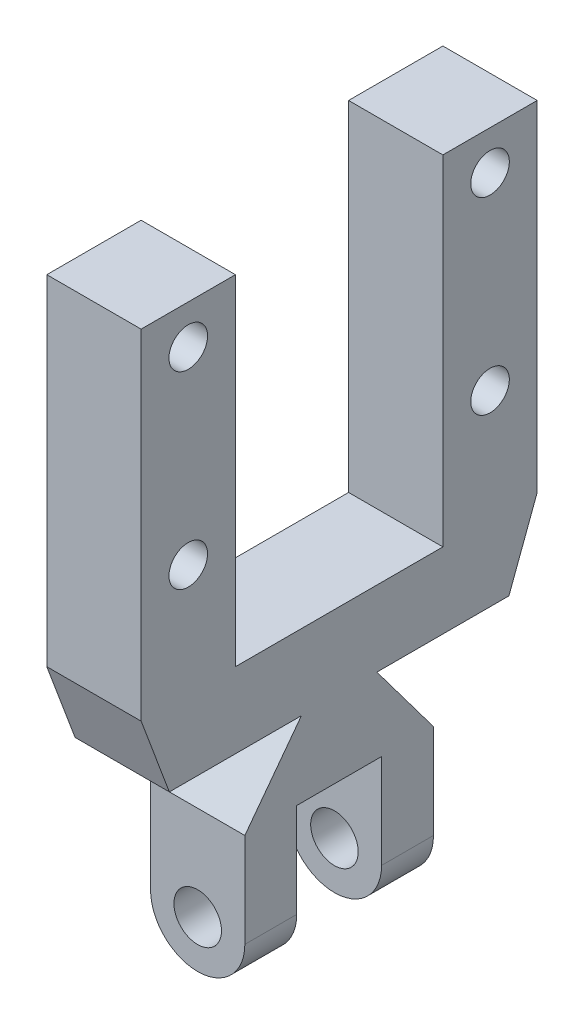
ISO-10303-21;
HEADER;
FILE_DESCRIPTION(('STEP AP214'),'2;1');
FILE_NAME('part.step','',(''),(''),'','','');
FILE_SCHEMA(('AUTOMOTIVE_DESIGN { 1 0 10303 214 1 1 1 1 }'));
ENDSEC;
DATA;
#1=APPLICATION_CONTEXT('core data for automotive mechanical design processes');
#2=APPLICATION_PROTOCOL_DEFINITION('international standard','automotive_design',2000,#1);
#3=PRODUCT_CONTEXT('',#1,'mechanical');
#4=PRODUCT('Part','Part','',(#3));
#5=PRODUCT_RELATED_PRODUCT_CATEGORY('part','',(#4));
#6=PRODUCT_DEFINITION_FORMATION('','',#4);
#7=PRODUCT_DEFINITION_CONTEXT('part definition',#1,'design');
#8=PRODUCT_DEFINITION('design','',#6,#7);
#9=PRODUCT_DEFINITION_SHAPE('','',#8);
#10=(LENGTH_UNIT() NAMED_UNIT(*) SI_UNIT(.MILLI.,.METRE.));
#11=(NAMED_UNIT(*) PLANE_ANGLE_UNIT() SI_UNIT($,.RADIAN.));
#12=(NAMED_UNIT(*) SI_UNIT($,.STERADIAN.) SOLID_ANGLE_UNIT());
#13=UNCERTAINTY_MEASURE_WITH_UNIT(LENGTH_MEASURE(1.E-05),#10,'distance_accuracy_value','');
#14=(GEOMETRIC_REPRESENTATION_CONTEXT(3) GLOBAL_UNCERTAINTY_ASSIGNED_CONTEXT((#13)) GLOBAL_UNIT_ASSIGNED_CONTEXT((#10,
#11,#12)) REPRESENTATION_CONTEXT('',''));
#15=CARTESIAN_POINT('',(0.,0.,0.));
#16=DIRECTION('',(0.,0.,1.));
#17=DIRECTION('',(1.,0.,0.));
#18=AXIS2_PLACEMENT_3D('',#15,#16,#17);
#19=CARTESIAN_POINT('',(6.35,0.,0.));
#20=DIRECTION('',(-1.,0.,0.));
#21=DIRECTION('',(0.,0.,1.));
#22=AXIS2_PLACEMENT_3D('',#19,#20,#21);
#23=PLANE('',#22);
#24=CARTESIAN_POINT('',(6.35,17.6898233954719,10.1599776289013));
#25=DIRECTION('',(1.,0.,0.));
#26=DIRECTION('',(0.,0.,-1.));
#27=AXIS2_PLACEMENT_3D('',#24,#25,#26);
#28=CIRCLE('',#27,1.3);
#29=CARTESIAN_POINT('',(6.35,17.6898233954719,8.85997762890133));
#30=VERTEX_POINT('',#29);
#31=EDGE_CURVE('E545',#30,#30,#28,.T.);
#32=ORIENTED_EDGE('',*,*,#31,.F.);
#33=EDGE_LOOP('',(#32));
#34=FACE_BOUND('',#33,.T.);
#35=CARTESIAN_POINT('',(6.35,30.3898233954719,10.1599776289013));
#36=DIRECTION('',(1.,0.,0.));
#37=DIRECTION('',(0.,0.,-1.));
#38=AXIS2_PLACEMENT_3D('',#35,#36,#37);
#39=CIRCLE('',#38,1.3);
#40=CARTESIAN_POINT('',(6.35,30.3898233954719,8.85997762890133));
#41=VERTEX_POINT('',#40);
#42=EDGE_CURVE('E537',#41,#41,#39,.T.);
#43=ORIENTED_EDGE('',*,*,#42,.F.);
#44=EDGE_LOOP('',(#43));
#45=FACE_BOUND('',#44,.T.);
#46=CARTESIAN_POINT('',(6.35,30.3898233954719,-10.1600223710987));
#47=DIRECTION('',(1.,0.,0.));
#48=DIRECTION('',(0.,0.,-1.));
#49=AXIS2_PLACEMENT_3D('',#46,#47,#48);
#50=CIRCLE('',#49,1.3);
#51=CARTESIAN_POINT('',(6.35,30.3898233954719,-11.4600223710987));
#52=VERTEX_POINT('',#51);
#53=EDGE_CURVE('E529',#52,#52,#50,.T.);
#54=ORIENTED_EDGE('',*,*,#53,.F.);
#55=EDGE_LOOP('',(#54));
#56=FACE_BOUND('',#55,.T.);
#57=CARTESIAN_POINT('',(6.35,17.6898233954719,-10.1600223710987));
#58=DIRECTION('',(1.,0.,0.));
#59=DIRECTION('',(0.,0.,-1.));
#60=AXIS2_PLACEMENT_3D('',#57,#58,#59);
#61=CIRCLE('',#60,1.3);
#62=CARTESIAN_POINT('',(6.35,17.6898233954719,-11.4600223710987));
#63=VERTEX_POINT('',#62);
#64=EDGE_CURVE('E523',#63,#63,#61,.T.);
#65=ORIENTED_EDGE('',*,*,#64,.F.);
#66=EDGE_LOOP('',(#65));
#67=FACE_BOUND('',#66,.T.);
#68=DIRECTION('',(0.,1.,0.));
#69=VECTOR('',#68,1.);
#70=CARTESIAN_POINT('',(6.35,0.,-2.8575));
#71=LINE('',#70,#69);
#72=CARTESIAN_POINT('',(6.35,-6.35,-2.8575));
#73=VERTEX_POINT('',#72);
#74=CARTESIAN_POINT('',(6.35,0.,-2.8575));
#75=VERTEX_POINT('',#74);
#76=EDGE_CURVE('E185',#73,#75,#71,.T.);
#77=ORIENTED_EDGE('',*,*,#76,.F.);
#78=DIRECTION('',(0.,0.,-1.));
#79=VECTOR('',#78,1.);
#80=CARTESIAN_POINT('',(6.35,-6.35,75.9664062837656));
#81=LINE('',#80,#79);
#82=CARTESIAN_POINT('',(6.35,-6.35,-6.34999999999999));
#83=VERTEX_POINT('',#82);
#84=EDGE_CURVE('E212',#73,#83,#81,.T.);
#85=ORIENTED_EDGE('',*,*,#84,.T.);
#86=DIRECTION('',(0.,1.,0.));
#87=VECTOR('',#86,1.);
#88=CARTESIAN_POINT('',(6.35,-9.525,-6.35));
#89=LINE('',#88,#87);
#90=CARTESIAN_POINT('',(6.35,0.,-6.35));
#91=VERTEX_POINT('',#90);
#92=EDGE_CURVE('E244',#83,#91,#89,.T.);
#93=ORIENTED_EDGE('',*,*,#92,.T.);
#94=DIRECTION('',(0.,0.8,0.6));
#95=VECTOR('',#94,1.);
#96=CARTESIAN_POINT('',(6.35,0.,-6.35));
#97=LINE('',#96,#95);
#98=CARTESIAN_POINT('',(6.35,5.08,-2.54));
#99=VERTEX_POINT('',#98);
#100=EDGE_CURVE('E247',#91,#99,#97,.T.);
#101=ORIENTED_EDGE('',*,*,#100,.T.);
#102=DIRECTION('',(0.,0.,-1.));
#103=VECTOR('',#102,1.);
#104=CARTESIAN_POINT('',(6.35,5.08,-2.54));
#105=LINE('',#104,#103);
#106=CARTESIAN_POINT('',(6.35,5.08,-11.43));
#107=VERTEX_POINT('',#106);
#108=EDGE_CURVE('E250',#99,#107,#105,.T.);
#109=ORIENTED_EDGE('',*,*,#108,.T.);
#110=DIRECTION('',(0.,0.936329177569044,-0.351123441588392));
#111=VECTOR('',#110,1.);
#112=CARTESIAN_POINT('',(6.35,5.08,-11.43));
#113=LINE('',#112,#111);
#114=CARTESIAN_POINT('',(6.35,10.16,-13.335));
#115=VERTEX_POINT('',#114);
#116=EDGE_CURVE('E253',#107,#115,#113,.T.);
#117=ORIENTED_EDGE('',*,*,#116,.T.);
#118=DIRECTION('',(0.,1.,0.));
#119=VECTOR('',#118,1.);
#120=CARTESIAN_POINT('',(6.35,10.16,-13.335));
#121=LINE('',#120,#119);
#122=CARTESIAN_POINT('',(6.35,33.02,-13.335));
#123=VERTEX_POINT('',#122);
#124=EDGE_CURVE('E256',#115,#123,#121,.T.);
#125=ORIENTED_EDGE('',*,*,#124,.T.);
#126=DIRECTION('',(0.,0.,1.));
#127=VECTOR('',#126,1.);
#128=CARTESIAN_POINT('',(6.35,33.02,-6.985));
#129=LINE('',#128,#127);
#130=CARTESIAN_POINT('',(6.35,33.02,-6.985));
#131=VERTEX_POINT('',#130);
#132=EDGE_CURVE('E259',#123,#131,#129,.T.);
#133=ORIENTED_EDGE('',*,*,#132,.T.);
#134=DIRECTION('',(0.,-1.,0.));
#135=VECTOR('',#134,1.);
#136=CARTESIAN_POINT('',(6.35,10.16,-6.985));
#137=LINE('',#136,#135);
#138=CARTESIAN_POINT('',(6.35,10.16,-6.985));
#139=VERTEX_POINT('',#138);
#140=EDGE_CURVE('E262',#131,#139,#137,.T.);
#141=ORIENTED_EDGE('',*,*,#140,.T.);
#142=DIRECTION('',(0.,0.,1.));
#143=VECTOR('',#142,1.);
#144=CARTESIAN_POINT('',(6.35,10.16,6.985));
#145=LINE('',#144,#143);
#146=CARTESIAN_POINT('',(6.35,10.16,6.985));
#147=VERTEX_POINT('',#146);
#148=EDGE_CURVE('E265',#139,#147,#145,.T.);
#149=ORIENTED_EDGE('',*,*,#148,.T.);
#150=DIRECTION('',(0.,1.,0.));
#151=VECTOR('',#150,1.);
#152=CARTESIAN_POINT('',(6.35,10.16,6.985));
#153=LINE('',#152,#151);
#154=CARTESIAN_POINT('',(6.35,33.02,6.985));
#155=VERTEX_POINT('',#154);
#156=EDGE_CURVE('E268',#147,#155,#153,.T.);
#157=ORIENTED_EDGE('',*,*,#156,.T.);
#158=DIRECTION('',(0.,0.,1.));
#159=VECTOR('',#158,1.);
#160=CARTESIAN_POINT('',(6.35,33.02,13.335));
#161=LINE('',#160,#159);
#162=CARTESIAN_POINT('',(6.35,33.02,13.335));
#163=VERTEX_POINT('',#162);
#164=EDGE_CURVE('E271',#155,#163,#161,.T.);
#165=ORIENTED_EDGE('',*,*,#164,.T.);
#166=DIRECTION('',(0.,-1.,0.));
#167=VECTOR('',#166,1.);
#168=CARTESIAN_POINT('',(6.35,10.16,13.335));
#169=LINE('',#168,#167);
#170=CARTESIAN_POINT('',(6.35,10.16,13.335));
#171=VERTEX_POINT('',#170);
#172=EDGE_CURVE('E274',#163,#171,#169,.T.);
#173=ORIENTED_EDGE('',*,*,#172,.T.);
#174=DIRECTION('',(0.,-0.936329177569044,-0.351123441588392));
#175=VECTOR('',#174,1.);
#176=CARTESIAN_POINT('',(6.35,5.08,11.43));
#177=LINE('',#176,#175);
#178=CARTESIAN_POINT('',(6.35,5.08,11.43));
#179=VERTEX_POINT('',#178);
#180=EDGE_CURVE('E230',#171,#179,#177,.T.);
#181=ORIENTED_EDGE('',*,*,#180,.T.);
#182=DIRECTION('',(0.,0.,-1.));
#183=VECTOR('',#182,1.);
#184=CARTESIAN_POINT('',(6.35,5.08,11.43));
#185=LINE('',#184,#183);
#186=CARTESIAN_POINT('',(6.35,5.08,2.54));
#187=VERTEX_POINT('',#186);
#188=EDGE_CURVE('E234',#179,#187,#185,.T.);
#189=ORIENTED_EDGE('',*,*,#188,.T.);
#190=DIRECTION('',(0.,-0.8,0.6));
#191=VECTOR('',#190,1.);
#192=CARTESIAN_POINT('',(6.35,0.,6.35));
#193=LINE('',#192,#191);
#194=CARTESIAN_POINT('',(6.35,0.,6.35));
#195=VERTEX_POINT('',#194);
#196=EDGE_CURVE('E238',#187,#195,#193,.T.);
#197=ORIENTED_EDGE('',*,*,#196,.T.);
#198=DIRECTION('',(0.,-1.,0.));
#199=VECTOR('',#198,1.);
#200=CARTESIAN_POINT('',(6.35,0.,6.35));
#201=LINE('',#200,#199);
#202=CARTESIAN_POINT('',(6.35,-6.35,6.35));
#203=VERTEX_POINT('',#202);
#204=EDGE_CURVE('E241',#195,#203,#201,.T.);
#205=ORIENTED_EDGE('',*,*,#204,.T.);
#206=CARTESIAN_POINT('',(6.35,-6.35,2.8575));
#207=VERTEX_POINT('',#206);
#208=EDGE_CURVE('E220',#203,#207,#81,.T.);
#209=ORIENTED_EDGE('',*,*,#208,.T.);
#210=DIRECTION('',(0.,1.,0.));
#211=VECTOR('',#210,1.);
#212=CARTESIAN_POINT('',(6.35,0.,2.8575));
#213=LINE('',#212,#211);
#214=CARTESIAN_POINT('',(6.35,0.,2.8575));
#215=VERTEX_POINT('',#214);
#216=EDGE_CURVE('E208',#207,#215,#213,.T.);
#217=ORIENTED_EDGE('',*,*,#216,.T.);
#218=DIRECTION('',(0.,0.,1.));
#219=VECTOR('',#218,1.);
#220=CARTESIAN_POINT('',(6.35,0.,-2.8575));
#221=LINE('',#220,#219);
#222=EDGE_CURVE('E199',#75,#215,#221,.T.);
#223=ORIENTED_EDGE('',*,*,#222,.F.);
#224=EDGE_LOOP('',(#77,#85,#93,#101,#109,#117,#125,#133,#141,#149,#157,#165,#173,#181,#189,#197,
#205,#209,#217,#223));
#225=FACE_BOUND('',#224,.T.);
#226=ADVANCED_FACE('F45',(#34,#45,#56,#67,#225),#23,.F.);
#227=CARTESIAN_POINT('',(0.,0.,0.));
#228=DIRECTION('',(-1.,0.,0.));
#229=DIRECTION('',(0.,0.,1.));
#230=AXIS2_PLACEMENT_3D('',#227,#228,#229);
#231=PLANE('',#230);
#232=CARTESIAN_POINT('',(0.,17.6898233954719,10.1599776289013));
#233=DIRECTION('',(1.,0.,0.));
#234=DIRECTION('',(0.,0.,-1.));
#235=AXIS2_PLACEMENT_3D('',#232,#233,#234);
#236=CIRCLE('',#235,1.3);
#237=CARTESIAN_POINT('',(0.,17.6898233954719,8.85997762890133));
#238=VERTEX_POINT('',#237);
#239=EDGE_CURVE('E541',#238,#238,#236,.T.);
#240=ORIENTED_EDGE('',*,*,#239,.T.);
#241=EDGE_LOOP('',(#240));
#242=FACE_BOUND('',#241,.T.);
#243=CARTESIAN_POINT('',(0.,30.3898233954719,10.1599776289013));
#244=DIRECTION('',(1.,0.,0.));
#245=DIRECTION('',(0.,0.,-1.));
#246=AXIS2_PLACEMENT_3D('',#243,#244,#245);
#247=CIRCLE('',#246,1.3);
#248=CARTESIAN_POINT('',(0.,30.3898233954719,8.85997762890134));
#249=VERTEX_POINT('',#248);
#250=EDGE_CURVE('E533',#249,#249,#247,.T.);
#251=ORIENTED_EDGE('',*,*,#250,.T.);
#252=EDGE_LOOP('',(#251));
#253=FACE_BOUND('',#252,.T.);
#254=CARTESIAN_POINT('',(0.,30.3898233954719,-10.1600223710987));
#255=DIRECTION('',(1.,0.,0.));
#256=DIRECTION('',(0.,0.,-1.));
#257=AXIS2_PLACEMENT_3D('',#254,#255,#256);
#258=CIRCLE('',#257,1.3);
#259=CARTESIAN_POINT('',(0.,30.3898233954719,-11.4600223710987));
#260=VERTEX_POINT('',#259);
#261=EDGE_CURVE('E526',#260,#260,#258,.T.);
#262=ORIENTED_EDGE('',*,*,#261,.T.);
#263=EDGE_LOOP('',(#262));
#264=FACE_BOUND('',#263,.T.);
#265=CARTESIAN_POINT('',(0.,17.6898233954719,-10.1600223710987));
#266=DIRECTION('',(1.,0.,0.));
#267=DIRECTION('',(0.,0.,-1.));
#268=AXIS2_PLACEMENT_3D('',#265,#266,#267);
#269=CIRCLE('',#268,1.3);
#270=CARTESIAN_POINT('',(0.,17.6898233954719,-11.4600223710987));
#271=VERTEX_POINT('',#270);
#272=EDGE_CURVE('E387',#271,#271,#269,.T.);
#273=ORIENTED_EDGE('',*,*,#272,.T.);
#274=EDGE_LOOP('',(#273));
#275=FACE_BOUND('',#274,.T.);
#276=DIRECTION('',(0.,0.,-1.));
#277=VECTOR('',#276,1.);
#278=CARTESIAN_POINT('',(0.,-6.35,75.9664062837656));
#279=LINE('',#278,#277);
#280=CARTESIAN_POINT('',(0.,-6.35,-2.8575));
#281=VERTEX_POINT('',#280);
#282=CARTESIAN_POINT('',(0.,-6.35,-6.35));
#283=VERTEX_POINT('',#282);
#284=EDGE_CURVE('E219',#281,#283,#279,.T.);
#285=ORIENTED_EDGE('',*,*,#284,.F.);
#286=DIRECTION('',(0.,-1.,0.));
#287=VECTOR('',#286,1.);
#288=CARTESIAN_POINT('',(0.,0.,-2.8575));
#289=LINE('',#288,#287);
#290=CARTESIAN_POINT('',(0.,0.,-2.8575));
#291=VERTEX_POINT('',#290);
#292=EDGE_CURVE('E194',#291,#281,#289,.T.);
#293=ORIENTED_EDGE('',*,*,#292,.F.);
#294=DIRECTION('',(0.,0.,1.));
#295=VECTOR('',#294,1.);
#296=CARTESIAN_POINT('',(0.,0.,-2.8575));
#297=LINE('',#296,#295);
#298=CARTESIAN_POINT('',(0.,0.,2.8575));
#299=VERTEX_POINT('',#298);
#300=EDGE_CURVE('E202',#291,#299,#297,.T.);
#301=ORIENTED_EDGE('',*,*,#300,.T.);
#302=DIRECTION('',(0.,-1.,0.));
#303=VECTOR('',#302,1.);
#304=CARTESIAN_POINT('',(0.,0.,2.8575));
#305=LINE('',#304,#303);
#306=CARTESIAN_POINT('',(0.,-6.35,2.8575));
#307=VERTEX_POINT('',#306);
#308=EDGE_CURVE('E381',#299,#307,#305,.T.);
#309=ORIENTED_EDGE('',*,*,#308,.T.);
#310=CARTESIAN_POINT('',(0.,-6.35,6.35));
#311=VERTEX_POINT('',#310);
#312=EDGE_CURVE('E216',#311,#307,#279,.T.);
#313=ORIENTED_EDGE('',*,*,#312,.F.);
#314=DIRECTION('',(0.,-1.,0.));
#315=VECTOR('',#314,1.);
#316=CARTESIAN_POINT('',(0.,0.,6.35));
#317=LINE('',#316,#315);
#318=CARTESIAN_POINT('',(0.,0.,6.35));
#319=VERTEX_POINT('',#318);
#320=EDGE_CURVE('E287',#319,#311,#317,.T.);
#321=ORIENTED_EDGE('',*,*,#320,.F.);
#322=DIRECTION('',(0.,-0.8,0.6));
#323=VECTOR('',#322,1.);
#324=CARTESIAN_POINT('',(0.,0.,6.35));
#325=LINE('',#324,#323);
#326=CARTESIAN_POINT('',(0.,5.08,2.54));
#327=VERTEX_POINT('',#326);
#328=EDGE_CURVE('E284',#327,#319,#325,.T.);
#329=ORIENTED_EDGE('',*,*,#328,.F.);
#330=DIRECTION('',(0.,0.,-1.));
#331=VECTOR('',#330,1.);
#332=CARTESIAN_POINT('',(0.,5.08,11.43));
#333=LINE('',#332,#331);
#334=CARTESIAN_POINT('',(0.,5.08,11.43));
#335=VERTEX_POINT('',#334);
#336=EDGE_CURVE('E281',#335,#327,#333,.T.);
#337=ORIENTED_EDGE('',*,*,#336,.F.);
#338=DIRECTION('',(0.,-0.936329177569044,-0.351123441588392));
#339=VECTOR('',#338,1.);
#340=CARTESIAN_POINT('',(0.,5.08,11.43));
#341=LINE('',#340,#339);
#342=CARTESIAN_POINT('',(0.,10.16,13.335));
#343=VERTEX_POINT('',#342);
#344=EDGE_CURVE('E229',#343,#335,#341,.T.);
#345=ORIENTED_EDGE('',*,*,#344,.F.);
#346=DIRECTION('',(0.,-1.,0.));
#347=VECTOR('',#346,1.);
#348=CARTESIAN_POINT('',(0.,10.16,13.335));
#349=LINE('',#348,#347);
#350=CARTESIAN_POINT('',(0.,33.02,13.335));
#351=VERTEX_POINT('',#350);
#352=EDGE_CURVE('E235',#351,#343,#349,.T.);
#353=ORIENTED_EDGE('',*,*,#352,.F.);
#354=DIRECTION('',(0.,0.,1.));
#355=VECTOR('',#354,1.);
#356=CARTESIAN_POINT('',(0.,33.02,13.335));
#357=LINE('',#356,#355);
#358=CARTESIAN_POINT('',(0.,33.02,6.985));
#359=VERTEX_POINT('',#358);
#360=EDGE_CURVE('E317',#359,#351,#357,.T.);
#361=ORIENTED_EDGE('',*,*,#360,.F.);
#362=DIRECTION('',(0.,1.,0.));
#363=VECTOR('',#362,1.);
#364=CARTESIAN_POINT('',(0.,10.16,6.985));
#365=LINE('',#364,#363);
#366=CARTESIAN_POINT('',(0.,10.16,6.985));
#367=VERTEX_POINT('',#366);
#368=EDGE_CURVE('E314',#367,#359,#365,.T.);
#369=ORIENTED_EDGE('',*,*,#368,.F.);
#370=DIRECTION('',(0.,0.,1.));
#371=VECTOR('',#370,1.);
#372=CARTESIAN_POINT('',(0.,10.16,6.985));
#373=LINE('',#372,#371);
#374=CARTESIAN_POINT('',(0.,10.16,-6.985));
#375=VERTEX_POINT('',#374);
#376=EDGE_CURVE('E311',#375,#367,#373,.T.);
#377=ORIENTED_EDGE('',*,*,#376,.F.);
#378=DIRECTION('',(0.,-1.,0.));
#379=VECTOR('',#378,1.);
#380=CARTESIAN_POINT('',(0.,10.16,-6.985));
#381=LINE('',#380,#379);
#382=CARTESIAN_POINT('',(0.,33.02,-6.985));
#383=VERTEX_POINT('',#382);
#384=EDGE_CURVE('E308',#383,#375,#381,.T.);
#385=ORIENTED_EDGE('',*,*,#384,.F.);
#386=DIRECTION('',(0.,0.,1.));
#387=VECTOR('',#386,1.);
#388=CARTESIAN_POINT('',(0.,33.02,-6.985));
#389=LINE('',#388,#387);
#390=CARTESIAN_POINT('',(0.,33.02,-13.335));
#391=VERTEX_POINT('',#390);
#392=EDGE_CURVE('E305',#391,#383,#389,.T.);
#393=ORIENTED_EDGE('',*,*,#392,.F.);
#394=DIRECTION('',(0.,1.,0.));
#395=VECTOR('',#394,1.);
#396=CARTESIAN_POINT('',(0.,10.16,-13.335));
#397=LINE('',#396,#395);
#398=CARTESIAN_POINT('',(0.,10.16,-13.335));
#399=VERTEX_POINT('',#398);
#400=EDGE_CURVE('E302',#399,#391,#397,.T.);
#401=ORIENTED_EDGE('',*,*,#400,.F.);
#402=DIRECTION('',(0.,0.936329177569044,-0.351123441588392));
#403=VECTOR('',#402,1.);
#404=CARTESIAN_POINT('',(0.,5.08,-11.43));
#405=LINE('',#404,#403);
#406=CARTESIAN_POINT('',(0.,5.08,-11.43));
#407=VERTEX_POINT('',#406);
#408=EDGE_CURVE('E299',#407,#399,#405,.T.);
#409=ORIENTED_EDGE('',*,*,#408,.F.);
#410=DIRECTION('',(0.,0.,-1.));
#411=VECTOR('',#410,1.);
#412=CARTESIAN_POINT('',(0.,5.08,-2.54));
#413=LINE('',#412,#411);
#414=CARTESIAN_POINT('',(0.,5.08,-2.54));
#415=VERTEX_POINT('',#414);
#416=EDGE_CURVE('E296',#415,#407,#413,.T.);
#417=ORIENTED_EDGE('',*,*,#416,.F.);
#418=DIRECTION('',(0.,0.8,0.6));
#419=VECTOR('',#418,1.);
#420=CARTESIAN_POINT('',(0.,0.,-6.35));
#421=LINE('',#420,#419);
#422=CARTESIAN_POINT('',(0.,0.,-6.35));
#423=VERTEX_POINT('',#422);
#424=EDGE_CURVE('E293',#423,#415,#421,.T.);
#425=ORIENTED_EDGE('',*,*,#424,.F.);
#426=DIRECTION('',(0.,1.,0.));
#427=VECTOR('',#426,1.);
#428=CARTESIAN_POINT('',(0.,-9.525,-6.35));
#429=LINE('',#428,#427);
#430=EDGE_CURVE('E290',#283,#423,#429,.T.);
#431=ORIENTED_EDGE('',*,*,#430,.F.);
#432=EDGE_LOOP('',(#285,#293,#301,#309,#313,#321,#329,#337,#345,#353,#361,#369,#377,#385,#393,
#401,#409,#417,#425,#431));
#433=FACE_BOUND('',#432,.T.);
#434=ADVANCED_FACE('F384',(#242,#253,#264,#275,#433),#231,.T.);
#435=CARTESIAN_POINT('',(3.175,-6.35,75.9664062837656));
#436=DIRECTION('',(0.,0.,-1.));
#437=DIRECTION('',(-1.,0.,0.));
#438=AXIS2_PLACEMENT_3D('',#435,#436,#437);
#439=CYLINDRICAL_SURFACE('',#438,3.175);
#440=ORIENTED_EDGE('',*,*,#84,.F.);
#441=CARTESIAN_POINT('',(3.175,-6.35,-2.8575));
#442=DIRECTION('',(0.,0.,1.));
#443=DIRECTION('',(1.,0.,0.));
#444=AXIS2_PLACEMENT_3D('',#441,#442,#443);
#445=CIRCLE('',#444,3.175);
#446=EDGE_CURVE('E11',#73,#281,#445,.F.);
#447=ORIENTED_EDGE('',*,*,#446,.T.);
#448=ORIENTED_EDGE('',*,*,#284,.T.);
#449=CARTESIAN_POINT('',(3.175,-6.35,-6.34999999999999));
#450=DIRECTION('',(0.,0.,1.));
#451=DIRECTION('',(1.,0.,0.));
#452=AXIS2_PLACEMENT_3D('',#449,#450,#451);
#453=CIRCLE('',#452,3.175);
#454=EDGE_CURVE('E223',#283,#83,#453,.T.);
#455=ORIENTED_EDGE('',*,*,#454,.T.);
#456=EDGE_LOOP('',(#440,#447,#448,#455));
#457=FACE_BOUND('',#456,.T.);
#458=ADVANCED_FACE('F393',(#457),#439,.T.);
#459=CARTESIAN_POINT('',(6.35,0.,6.35));
#460=DIRECTION('',(0.,0.,-1.));
#461=DIRECTION('',(-1.,0.,0.));
#462=AXIS2_PLACEMENT_3D('',#459,#460,#461);
#463=PLANE('',#462);
#464=CARTESIAN_POINT('',(3.175,-6.35,6.35));
#465=DIRECTION('',(0.,0.,1.));
#466=DIRECTION('',(1.,0.,0.));
#467=AXIS2_PLACEMENT_3D('',#464,#465,#466);
#468=CIRCLE('',#467,1.6);
#469=CARTESIAN_POINT('',(4.775,-6.35,6.35));
#470=VERTEX_POINT('',#469);
#471=EDGE_CURVE('E560',#470,#470,#468,.T.);
#472=ORIENTED_EDGE('',*,*,#471,.F.);
#473=EDGE_LOOP('',(#472));
#474=FACE_BOUND('',#473,.T.);
#475=CARTESIAN_POINT('',(3.175,-6.35,6.34999999999999));
#476=DIRECTION('',(0.,0.,-1.));
#477=DIRECTION('',(-1.,0.,0.));
#478=AXIS2_PLACEMENT_3D('',#475,#476,#477);
#479=CIRCLE('',#478,3.175);
#480=EDGE_CURVE('E62',#203,#311,#479,.T.);
#481=ORIENTED_EDGE('',*,*,#480,.F.);
#482=ORIENTED_EDGE('',*,*,#204,.F.);
#483=DIRECTION('',(-1.,0.,0.));
#484=VECTOR('',#483,1.);
#485=CARTESIAN_POINT('',(6.35,0.,6.35));
#486=LINE('',#485,#484);
#487=EDGE_CURVE('E365',#195,#319,#486,.T.);
#488=ORIENTED_EDGE('',*,*,#487,.T.);
#489=ORIENTED_EDGE('',*,*,#320,.T.);
#490=EDGE_LOOP('',(#481,#482,#488,#489));
#491=FACE_BOUND('',#490,.T.);
#492=ADVANCED_FACE('F404',(#474,#491),#463,.F.);
#493=CARTESIAN_POINT('',(6.35,-9.525,-6.35));
#494=DIRECTION('',(0.,0.,1.));
#495=DIRECTION('',(1.,0.,0.));
#496=AXIS2_PLACEMENT_3D('',#493,#494,#495);
#497=PLANE('',#496);
#498=CARTESIAN_POINT('',(3.175,-6.35,-6.35));
#499=DIRECTION('',(0.,0.,1.));
#500=DIRECTION('',(1.,0.,0.));
#501=AXIS2_PLACEMENT_3D('',#498,#499,#500);
#502=CIRCLE('',#501,1.6);
#503=CARTESIAN_POINT('',(4.775,-6.35,-6.35));
#504=VERTEX_POINT('',#503);
#505=EDGE_CURVE('E49',#504,#504,#502,.T.);
#506=ORIENTED_EDGE('',*,*,#505,.T.);
#507=EDGE_LOOP('',(#506));
#508=FACE_BOUND('',#507,.T.);
#509=ORIENTED_EDGE('',*,*,#454,.F.);
#510=ORIENTED_EDGE('',*,*,#430,.T.);
#511=DIRECTION('',(-1.,0.,0.));
#512=VECTOR('',#511,1.);
#513=CARTESIAN_POINT('',(6.35,0.,-6.35));
#514=LINE('',#513,#512);
#515=EDGE_CURVE('E361',#91,#423,#514,.T.);
#516=ORIENTED_EDGE('',*,*,#515,.F.);
#517=ORIENTED_EDGE('',*,*,#92,.F.);
#518=EDGE_LOOP('',(#509,#510,#516,#517));
#519=FACE_BOUND('',#518,.T.);
#520=ADVANCED_FACE('F452',(#508,#519),#497,.F.);
#521=CARTESIAN_POINT('',(6.35,5.08,11.43));
#522=DIRECTION('',(0.,0.351123441588392,-0.936329177569044));
#523=DIRECTION('',(0.,0.936329177569045,0.351123441588392));
#524=AXIS2_PLACEMENT_3D('',#521,#522,#523);
#525=PLANE('',#524);
#526=ORIENTED_EDGE('',*,*,#344,.T.);
#527=DIRECTION('',(-1.,0.,0.));
#528=VECTOR('',#527,1.);
#529=CARTESIAN_POINT('',(6.35,5.08,11.43));
#530=LINE('',#529,#528);
#531=EDGE_CURVE('E373',#179,#335,#530,.T.);
#532=ORIENTED_EDGE('',*,*,#531,.F.);
#533=ORIENTED_EDGE('',*,*,#180,.F.);
#534=DIRECTION('',(-1.,0.,0.));
#535=VECTOR('',#534,1.);
#536=CARTESIAN_POINT('',(6.35,10.16,13.335));
#537=LINE('',#536,#535);
#538=EDGE_CURVE('E277',#171,#343,#537,.T.);
#539=ORIENTED_EDGE('',*,*,#538,.T.);
#540=EDGE_LOOP('',(#526,#532,#533,#539));
#541=FACE_BOUND('',#540,.T.);
#542=ADVANCED_FACE('F47',(#541),#525,.F.);
#543=CARTESIAN_POINT('',(6.35,5.08,11.43));
#544=DIRECTION('',(0.,1.,0.));
#545=DIRECTION('',(0.,0.,1.));
#546=AXIS2_PLACEMENT_3D('',#543,#544,#545);
#547=PLANE('',#546);
#548=ORIENTED_EDGE('',*,*,#336,.T.);
#549=DIRECTION('',(-1.,0.,0.));
#550=VECTOR('',#549,1.);
#551=CARTESIAN_POINT('',(6.35,5.08,2.54));
#552=LINE('',#551,#550);
#553=EDGE_CURVE('E369',#187,#327,#552,.T.);
#554=ORIENTED_EDGE('',*,*,#553,.F.);
#555=ORIENTED_EDGE('',*,*,#188,.F.);
#556=ORIENTED_EDGE('',*,*,#531,.T.);
#557=EDGE_LOOP('',(#548,#554,#555,#556));
#558=FACE_BOUND('',#557,.T.);
#559=ADVANCED_FACE('F460',(#558),#547,.F.);
#560=CARTESIAN_POINT('',(6.35,0.,6.35));
#561=DIRECTION('',(0.,-0.6,-0.8));
#562=DIRECTION('',(0.,0.8,-0.6));
#563=AXIS2_PLACEMENT_3D('',#560,#561,#562);
#564=PLANE('',#563);
#565=ORIENTED_EDGE('',*,*,#328,.T.);
#566=ORIENTED_EDGE('',*,*,#487,.F.);
#567=ORIENTED_EDGE('',*,*,#196,.F.);
#568=ORIENTED_EDGE('',*,*,#553,.T.);
#569=EDGE_LOOP('',(#565,#566,#567,#568));
#570=FACE_BOUND('',#569,.T.);
#571=ADVANCED_FACE('F450',(#570),#564,.F.);
#572=CARTESIAN_POINT('',(6.35,0.,-6.35));
#573=DIRECTION('',(0.,-0.6,0.8));
#574=DIRECTION('',(0.,-0.8,-0.6));
#575=AXIS2_PLACEMENT_3D('',#572,#573,#574);
#576=PLANE('',#575);
#577=ORIENTED_EDGE('',*,*,#424,.T.);
#578=DIRECTION('',(-1.,0.,0.));
#579=VECTOR('',#578,1.);
#580=CARTESIAN_POINT('',(6.35,5.08,-2.54));
#581=LINE('',#580,#579);
#582=EDGE_CURVE('E357',#99,#415,#581,.T.);
#583=ORIENTED_EDGE('',*,*,#582,.F.);
#584=ORIENTED_EDGE('',*,*,#100,.F.);
#585=ORIENTED_EDGE('',*,*,#515,.T.);
#586=EDGE_LOOP('',(#577,#583,#584,#585));
#587=FACE_BOUND('',#586,.T.);
#588=ADVANCED_FACE('F446',(#587),#576,.F.);
#589=CARTESIAN_POINT('',(6.35,5.08,-2.54));
#590=DIRECTION('',(0.,1.,0.));
#591=DIRECTION('',(0.,0.,1.));
#592=AXIS2_PLACEMENT_3D('',#589,#590,#591);
#593=PLANE('',#592);
#594=ORIENTED_EDGE('',*,*,#416,.T.);
#595=DIRECTION('',(-1.,0.,0.));
#596=VECTOR('',#595,1.);
#597=CARTESIAN_POINT('',(6.35,5.08,-11.43));
#598=LINE('',#597,#596);
#599=EDGE_CURVE('E353',#107,#407,#598,.T.);
#600=ORIENTED_EDGE('',*,*,#599,.F.);
#601=ORIENTED_EDGE('',*,*,#108,.F.);
#602=ORIENTED_EDGE('',*,*,#582,.T.);
#603=EDGE_LOOP('',(#594,#600,#601,#602));
#604=FACE_BOUND('',#603,.T.);
#605=ADVANCED_FACE('F442',(#604),#593,.F.);
#606=CARTESIAN_POINT('',(6.35,5.08,-11.43));
#607=DIRECTION('',(0.,0.351123441588392,0.936329177569044));
#608=DIRECTION('',(0.,-0.936329177569045,0.351123441588392));
#609=AXIS2_PLACEMENT_3D('',#606,#607,#608);
#610=PLANE('',#609);
#611=ORIENTED_EDGE('',*,*,#408,.T.);
#612=DIRECTION('',(-1.,0.,0.));
#613=VECTOR('',#612,1.);
#614=CARTESIAN_POINT('',(6.35,10.16,-13.335));
#615=LINE('',#614,#613);
#616=EDGE_CURVE('E349',#115,#399,#615,.T.);
#617=ORIENTED_EDGE('',*,*,#616,.F.);
#618=ORIENTED_EDGE('',*,*,#116,.F.);
#619=ORIENTED_EDGE('',*,*,#599,.T.);
#620=EDGE_LOOP('',(#611,#617,#618,#619));
#621=FACE_BOUND('',#620,.T.);
#622=ADVANCED_FACE('F438',(#621),#610,.F.);
#623=CARTESIAN_POINT('',(6.35,10.16,-13.335));
#624=DIRECTION('',(0.,0.,1.));
#625=DIRECTION('',(1.,0.,0.));
#626=AXIS2_PLACEMENT_3D('',#623,#624,#625);
#627=PLANE('',#626);
#628=ORIENTED_EDGE('',*,*,#400,.T.);
#629=DIRECTION('',(-1.,0.,0.));
#630=VECTOR('',#629,1.);
#631=CARTESIAN_POINT('',(6.35,33.02,-13.335));
#632=LINE('',#631,#630);
#633=EDGE_CURVE('E345',#123,#391,#632,.T.);
#634=ORIENTED_EDGE('',*,*,#633,.F.);
#635=ORIENTED_EDGE('',*,*,#124,.F.);
#636=ORIENTED_EDGE('',*,*,#616,.T.);
#637=EDGE_LOOP('',(#628,#634,#635,#636));
#638=FACE_BOUND('',#637,.T.);
#639=ADVANCED_FACE('F434',(#638),#627,.F.);
#640=CARTESIAN_POINT('',(6.35,33.02,-6.985));
#641=DIRECTION('',(0.,-1.,0.));
#642=DIRECTION('',(0.,0.,-1.));
#643=AXIS2_PLACEMENT_3D('',#640,#641,#642);
#644=PLANE('',#643);
#645=ORIENTED_EDGE('',*,*,#392,.T.);
#646=DIRECTION('',(-1.,0.,0.));
#647=VECTOR('',#646,1.);
#648=CARTESIAN_POINT('',(6.35,33.02,-6.985));
#649=LINE('',#648,#647);
#650=EDGE_CURVE('E341',#131,#383,#649,.T.);
#651=ORIENTED_EDGE('',*,*,#650,.F.);
#652=ORIENTED_EDGE('',*,*,#132,.F.);
#653=ORIENTED_EDGE('',*,*,#633,.T.);
#654=EDGE_LOOP('',(#645,#651,#652,#653));
#655=FACE_BOUND('',#654,.T.);
#656=ADVANCED_FACE('F430',(#655),#644,.F.);
#657=CARTESIAN_POINT('',(6.35,10.16,-6.985));
#658=DIRECTION('',(0.,0.,-1.));
#659=DIRECTION('',(-1.,0.,0.));
#660=AXIS2_PLACEMENT_3D('',#657,#658,#659);
#661=PLANE('',#660);
#662=ORIENTED_EDGE('',*,*,#384,.T.);
#663=DIRECTION('',(-1.,0.,0.));
#664=VECTOR('',#663,1.);
#665=CARTESIAN_POINT('',(6.35,10.16,-6.985));
#666=LINE('',#665,#664);
#667=EDGE_CURVE('E337',#139,#375,#666,.T.);
#668=ORIENTED_EDGE('',*,*,#667,.F.);
#669=ORIENTED_EDGE('',*,*,#140,.F.);
#670=ORIENTED_EDGE('',*,*,#650,.T.);
#671=EDGE_LOOP('',(#662,#668,#669,#670));
#672=FACE_BOUND('',#671,.T.);
#673=ADVANCED_FACE('F426',(#672),#661,.F.);
#674=CARTESIAN_POINT('',(6.35,10.16,6.985));
#675=DIRECTION('',(0.,-1.,0.));
#676=DIRECTION('',(0.,0.,-1.));
#677=AXIS2_PLACEMENT_3D('',#674,#675,#676);
#678=PLANE('',#677);
#679=ORIENTED_EDGE('',*,*,#376,.T.);
#680=DIRECTION('',(-1.,0.,0.));
#681=VECTOR('',#680,1.);
#682=CARTESIAN_POINT('',(6.35,10.16,6.985));
#683=LINE('',#682,#681);
#684=EDGE_CURVE('E333',#147,#367,#683,.T.);
#685=ORIENTED_EDGE('',*,*,#684,.F.);
#686=ORIENTED_EDGE('',*,*,#148,.F.);
#687=ORIENTED_EDGE('',*,*,#667,.T.);
#688=EDGE_LOOP('',(#679,#685,#686,#687));
#689=FACE_BOUND('',#688,.T.);
#690=ADVANCED_FACE('F422',(#689),#678,.F.);
#691=CARTESIAN_POINT('',(6.35,10.16,6.985));
#692=DIRECTION('',(0.,0.,1.));
#693=DIRECTION('',(1.,0.,0.));
#694=AXIS2_PLACEMENT_3D('',#691,#692,#693);
#695=PLANE('',#694);
#696=ORIENTED_EDGE('',*,*,#368,.T.);
#697=DIRECTION('',(-1.,0.,0.));
#698=VECTOR('',#697,1.);
#699=CARTESIAN_POINT('',(6.35,33.02,6.985));
#700=LINE('',#699,#698);
#701=EDGE_CURVE('E329',#155,#359,#700,.T.);
#702=ORIENTED_EDGE('',*,*,#701,.F.);
#703=ORIENTED_EDGE('',*,*,#156,.F.);
#704=ORIENTED_EDGE('',*,*,#684,.T.);
#705=EDGE_LOOP('',(#696,#702,#703,#704));
#706=FACE_BOUND('',#705,.T.);
#707=ADVANCED_FACE('F418',(#706),#695,.F.);
#708=CARTESIAN_POINT('',(6.35,33.02,13.335));
#709=DIRECTION('',(0.,-1.,0.));
#710=DIRECTION('',(0.,0.,-1.));
#711=AXIS2_PLACEMENT_3D('',#708,#709,#710);
#712=PLANE('',#711);
#713=ORIENTED_EDGE('',*,*,#360,.T.);
#714=DIRECTION('',(-1.,0.,0.));
#715=VECTOR('',#714,1.);
#716=CARTESIAN_POINT('',(6.35,33.02,13.335));
#717=LINE('',#716,#715);
#718=EDGE_CURVE('E325',#163,#351,#717,.T.);
#719=ORIENTED_EDGE('',*,*,#718,.F.);
#720=ORIENTED_EDGE('',*,*,#164,.F.);
#721=ORIENTED_EDGE('',*,*,#701,.T.);
#722=EDGE_LOOP('',(#713,#719,#720,#721));
#723=FACE_BOUND('',#722,.T.);
#724=ADVANCED_FACE('F400',(#723),#712,.F.);
#725=CARTESIAN_POINT('',(6.35,10.16,13.335));
#726=DIRECTION('',(0.,0.,-1.));
#727=DIRECTION('',(-1.,0.,0.));
#728=AXIS2_PLACEMENT_3D('',#725,#726,#727);
#729=PLANE('',#728);
#730=ORIENTED_EDGE('',*,*,#352,.T.);
#731=ORIENTED_EDGE('',*,*,#538,.F.);
#732=ORIENTED_EDGE('',*,*,#172,.F.);
#733=ORIENTED_EDGE('',*,*,#718,.T.);
#734=EDGE_LOOP('',(#730,#731,#732,#733));
#735=FACE_BOUND('',#734,.T.);
#736=ADVANCED_FACE('F391',(#735),#729,.F.);
#737=CARTESIAN_POINT('',(3.175,-6.35,2.8575));
#738=DIRECTION('',(0.,0.,1.));
#739=DIRECTION('',(1.,0.,0.));
#740=AXIS2_PLACEMENT_3D('',#737,#738,#739);
#741=CIRCLE('',#740,3.175);
#742=EDGE_CURVE('E55',#207,#307,#741,.F.);
#743=ORIENTED_EDGE('',*,*,#742,.F.);
#744=ORIENTED_EDGE('',*,*,#208,.F.);
#745=ORIENTED_EDGE('',*,*,#480,.T.);
#746=ORIENTED_EDGE('',*,*,#312,.T.);
#747=EDGE_LOOP('',(#743,#744,#745,#746));
#748=FACE_BOUND('',#747,.T.);
#749=ADVANCED_FACE('F389',(#748),#439,.T.);
#750=CARTESIAN_POINT('',(0.,0.,-2.8575));
#751=DIRECTION('',(0.,1.,0.));
#752=DIRECTION('',(0.,0.,1.));
#753=AXIS2_PLACEMENT_3D('',#750,#751,#752);
#754=PLANE('',#753);
#755=DIRECTION('',(-1.,0.,0.));
#756=VECTOR('',#755,1.);
#757=CARTESIAN_POINT('',(0.,0.,2.8575));
#758=LINE('',#757,#756);
#759=EDGE_CURVE('E513',#215,#299,#758,.T.);
#760=ORIENTED_EDGE('',*,*,#759,.T.);
#761=ORIENTED_EDGE('',*,*,#300,.F.);
#762=DIRECTION('',(-1.,0.,0.));
#763=VECTOR('',#762,1.);
#764=CARTESIAN_POINT('',(0.,0.,-2.8575));
#765=LINE('',#764,#763);
#766=EDGE_CURVE('E188',#75,#291,#765,.T.);
#767=ORIENTED_EDGE('',*,*,#766,.F.);
#768=ORIENTED_EDGE('',*,*,#222,.T.);
#769=EDGE_LOOP('',(#760,#761,#767,#768));
#770=FACE_BOUND('',#769,.T.);
#771=ADVANCED_FACE('F198',(#770),#754,.F.);
#772=CARTESIAN_POINT('',(0.,0.,-2.8575));
#773=DIRECTION('',(0.,0.,1.));
#774=DIRECTION('',(1.,0.,0.));
#775=AXIS2_PLACEMENT_3D('',#772,#773,#774);
#776=PLANE('',#775);
#777=CARTESIAN_POINT('',(3.175,-6.35,-2.8575));
#778=DIRECTION('',(0.,0.,1.));
#779=DIRECTION('',(1.,0.,0.));
#780=AXIS2_PLACEMENT_3D('',#777,#778,#779);
#781=CIRCLE('',#780,1.6);
#782=CARTESIAN_POINT('',(4.775,-6.35,-2.8575));
#783=VERTEX_POINT('',#782);
#784=EDGE_CURVE('E553',#783,#783,#781,.T.);
#785=ORIENTED_EDGE('',*,*,#784,.F.);
#786=EDGE_LOOP('',(#785));
#787=FACE_BOUND('',#786,.T.);
#788=ORIENTED_EDGE('',*,*,#76,.T.);
#789=ORIENTED_EDGE('',*,*,#766,.T.);
#790=ORIENTED_EDGE('',*,*,#292,.T.);
#791=ORIENTED_EDGE('',*,*,#446,.F.);
#792=EDGE_LOOP('',(#788,#789,#790,#791));
#793=FACE_BOUND('',#792,.T.);
#794=ADVANCED_FACE('F187',(#787,#793),#776,.T.);
#795=CARTESIAN_POINT('',(0.,0.,2.8575));
#796=DIRECTION('',(0.,0.,1.));
#797=DIRECTION('',(1.,0.,0.));
#798=AXIS2_PLACEMENT_3D('',#795,#796,#797);
#799=PLANE('',#798);
#800=CARTESIAN_POINT('',(3.175,-6.35,2.8575));
#801=DIRECTION('',(0.,0.,1.));
#802=DIRECTION('',(1.,0.,0.));
#803=AXIS2_PLACEMENT_3D('',#800,#801,#802);
#804=CIRCLE('',#803,1.6);
#805=CARTESIAN_POINT('',(4.775,-6.35,2.8575));
#806=VERTEX_POINT('',#805);
#807=EDGE_CURVE('E549',#806,#806,#804,.T.);
#808=ORIENTED_EDGE('',*,*,#807,.T.);
#809=EDGE_LOOP('',(#808));
#810=FACE_BOUND('',#809,.T.);
#811=ORIENTED_EDGE('',*,*,#216,.F.);
#812=ORIENTED_EDGE('',*,*,#742,.T.);
#813=ORIENTED_EDGE('',*,*,#308,.F.);
#814=ORIENTED_EDGE('',*,*,#759,.F.);
#815=EDGE_LOOP('',(#811,#812,#813,#814));
#816=FACE_BOUND('',#815,.T.);
#817=ADVANCED_FACE('F380',(#810,#816),#799,.F.);
#818=CARTESIAN_POINT('',(6.35,17.6898233954719,-10.1600223710987));
#819=DIRECTION('',(1.,0.,0.));
#820=DIRECTION('',(0.,0.,-1.));
#821=AXIS2_PLACEMENT_3D('',#818,#819,#820);
#822=CYLINDRICAL_SURFACE('',#821,1.3);
#823=ORIENTED_EDGE('',*,*,#272,.F.);
#824=EDGE_LOOP('',(#823));
#825=FACE_BOUND('',#824,.T.);
#826=ORIENTED_EDGE('',*,*,#64,.T.);
#827=EDGE_LOOP('',(#826));
#828=FACE_BOUND('',#827,.T.);
#829=ADVANCED_FACE('F573',(#825,#828),#822,.F.);
#830=CARTESIAN_POINT('',(6.35,30.3898233954719,-10.1600223710987));
#831=DIRECTION('',(1.,0.,0.));
#832=DIRECTION('',(0.,0.,-1.));
#833=AXIS2_PLACEMENT_3D('',#830,#831,#832);
#834=CYLINDRICAL_SURFACE('',#833,1.3);
#835=ORIENTED_EDGE('',*,*,#261,.F.);
#836=EDGE_LOOP('',(#835));
#837=FACE_BOUND('',#836,.T.);
#838=ORIENTED_EDGE('',*,*,#53,.T.);
#839=EDGE_LOOP('',(#838));
#840=FACE_BOUND('',#839,.T.);
#841=ADVANCED_FACE('F580',(#837,#840),#834,.F.);
#842=CARTESIAN_POINT('',(6.35,30.3898233954719,10.1599776289013));
#843=DIRECTION('',(1.,0.,0.));
#844=DIRECTION('',(0.,0.,-1.));
#845=AXIS2_PLACEMENT_3D('',#842,#843,#844);
#846=CYLINDRICAL_SURFACE('',#845,1.3);
#847=ORIENTED_EDGE('',*,*,#250,.F.);
#848=EDGE_LOOP('',(#847));
#849=FACE_BOUND('',#848,.T.);
#850=ORIENTED_EDGE('',*,*,#42,.T.);
#851=EDGE_LOOP('',(#850));
#852=FACE_BOUND('',#851,.T.);
#853=ADVANCED_FACE('F588',(#849,#852),#846,.F.);
#854=CARTESIAN_POINT('',(6.35,17.6898233954719,10.1599776289013));
#855=DIRECTION('',(1.,0.,0.));
#856=DIRECTION('',(0.,0.,-1.));
#857=AXIS2_PLACEMENT_3D('',#854,#855,#856);
#858=CYLINDRICAL_SURFACE('',#857,1.3);
#859=ORIENTED_EDGE('',*,*,#239,.F.);
#860=EDGE_LOOP('',(#859));
#861=FACE_BOUND('',#860,.T.);
#862=ORIENTED_EDGE('',*,*,#31,.T.);
#863=EDGE_LOOP('',(#862));
#864=FACE_BOUND('',#863,.T.);
#865=ADVANCED_FACE('F592',(#861,#864),#858,.F.);
#866=CARTESIAN_POINT('',(3.175,-6.35,6.35));
#867=DIRECTION('',(0.,0.,1.));
#868=DIRECTION('',(1.,0.,0.));
#869=AXIS2_PLACEMENT_3D('',#866,#867,#868);
#870=CYLINDRICAL_SURFACE('',#869,1.6);
#871=ORIENTED_EDGE('',*,*,#784,.T.);
#872=EDGE_LOOP('',(#871));
#873=FACE_BOUND('',#872,.T.);
#874=ORIENTED_EDGE('',*,*,#505,.F.);
#875=EDGE_LOOP('',(#874));
#876=FACE_BOUND('',#875,.T.);
#877=ADVANCED_FACE('F568',(#873,#876),#870,.F.);
#878=ORIENTED_EDGE('',*,*,#471,.T.);
#879=EDGE_LOOP('',(#878));
#880=FACE_BOUND('',#879,.T.);
#881=ORIENTED_EDGE('',*,*,#807,.F.);
#882=EDGE_LOOP('',(#881));
#883=FACE_BOUND('',#882,.T.);
#884=ADVANCED_FACE('F565',(#880,#883),#870,.F.);
#885=CLOSED_SHELL('',(#226,#434,#458,#492,#520,#542,#559,#571,#588,#605,#622,#639,#656,#673,
#690,#707,#724,#736,#749,#771,#794,#817,#829,#841,#853,#865,#877,#884));
#886=MANIFOLD_SOLID_BREP('B2',#885);
#887=ADVANCED_BREP_SHAPE_REPRESENTATION('',(#18,#886),#14);
#888=SHAPE_DEFINITION_REPRESENTATION(#9,#887);
ENDSEC;
END-ISO-10303-21;
